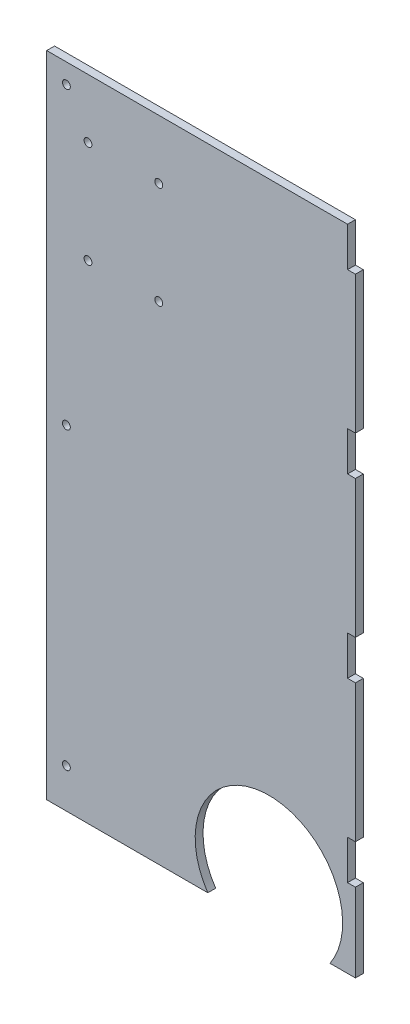
ISO-10303-21;
HEADER;
FILE_DESCRIPTION(('STEP AP214'),'2;1');
FILE_NAME('part.step','',(''),(''),'','','');
FILE_SCHEMA(('AUTOMOTIVE_DESIGN { 1 0 10303 214 1 1 1 1 }'));
ENDSEC;
DATA;
#1=APPLICATION_CONTEXT('core data for automotive mechanical design processes');
#2=APPLICATION_PROTOCOL_DEFINITION('international standard','automotive_design',2000,#1);
#3=PRODUCT_CONTEXT('',#1,'mechanical');
#4=PRODUCT('Part','Part','',(#3));
#5=PRODUCT_RELATED_PRODUCT_CATEGORY('part','',(#4));
#6=PRODUCT_DEFINITION_FORMATION('','',#4);
#7=PRODUCT_DEFINITION_CONTEXT('part definition',#1,'design');
#8=PRODUCT_DEFINITION('design','',#6,#7);
#9=PRODUCT_DEFINITION_SHAPE('','',#8);
#10=(LENGTH_UNIT() NAMED_UNIT(*) SI_UNIT(.MILLI.,.METRE.));
#11=(NAMED_UNIT(*) PLANE_ANGLE_UNIT() SI_UNIT($,.RADIAN.));
#12=(NAMED_UNIT(*) SI_UNIT($,.STERADIAN.) SOLID_ANGLE_UNIT());
#13=UNCERTAINTY_MEASURE_WITH_UNIT(LENGTH_MEASURE(1.E-05),#10,'distance_accuracy_value','');
#14=(GEOMETRIC_REPRESENTATION_CONTEXT(3) GLOBAL_UNCERTAINTY_ASSIGNED_CONTEXT((#13)) GLOBAL_UNIT_ASSIGNED_CONTEXT((#10,
#11,#12)) REPRESENTATION_CONTEXT('',''));
#15=CARTESIAN_POINT('',(0.,0.,0.));
#16=DIRECTION('',(0.,0.,1.));
#17=DIRECTION('',(1.,0.,0.));
#18=AXIS2_PLACEMENT_3D('',#15,#16,#17);
#19=CARTESIAN_POINT('',(82.0000000000016,149.999999999996,4.));
#20=DIRECTION('',(-1.,0.,0.));
#21=DIRECTION('',(0.,-1.,0.));
#22=AXIS2_PLACEMENT_3D('',#19,#20,#21);
#23=PLANE('',#22);
#24=DIRECTION('',(0.,1.,0.));
#25=VECTOR('',#24,1.);
#26=CARTESIAN_POINT('',(82.0000000000016,149.999999999996,0.));
#27=LINE('',#26,#25);
#28=CARTESIAN_POINT('',(82.0000000000016,-30.0000000000036,0.));
#29=VERTEX_POINT('',#28);
#30=CARTESIAN_POINT('',(82.0000000000015,39.9999999999964,0.));
#31=VERTEX_POINT('',#30);
#32=EDGE_CURVE('E445',#29,#31,#27,.T.);
#33=ORIENTED_EDGE('',*,*,#32,.T.);
#34=DIRECTION('',(0.,0.,-1.));
#35=VECTOR('',#34,1.);
#36=CARTESIAN_POINT('',(82.0000000000015,39.9999999999964,4.));
#37=LINE('',#36,#35);
#38=CARTESIAN_POINT('',(82.0000000000015,39.9999999999964,4.));
#39=VERTEX_POINT('',#38);
#40=EDGE_CURVE('E466',#39,#31,#37,.T.);
#41=ORIENTED_EDGE('',*,*,#40,.F.);
#42=DIRECTION('',(0.,1.,0.));
#43=VECTOR('',#42,1.);
#44=CARTESIAN_POINT('',(82.0000000000016,149.999999999996,4.));
#45=LINE('',#44,#43);
#46=CARTESIAN_POINT('',(82.0000000000016,-30.0000000000036,4.));
#47=VERTEX_POINT('',#46);
#48=EDGE_CURVE('E449',#47,#39,#45,.T.);
#49=ORIENTED_EDGE('',*,*,#48,.F.);
#50=DIRECTION('',(0.,0.,-1.));
#51=VECTOR('',#50,1.);
#52=CARTESIAN_POINT('',(82.0000000000016,-30.0000000000036,4.));
#53=LINE('',#52,#51);
#54=EDGE_CURVE('E464',#47,#29,#53,.T.);
#55=ORIENTED_EDGE('',*,*,#54,.T.);
#56=EDGE_LOOP('',(#33,#41,#49,#55));
#57=FACE_BOUND('',#56,.T.);
#58=ADVANCED_FACE('F33',(#57),#23,.F.);
#59=CARTESIAN_POINT('',(82.0000000000015,-120.000000000004,0.));
#60=VERTEX_POINT('',#59);
#61=CARTESIAN_POINT('',(82.0000000000016,-50.0000000000036,0.));
#62=VERTEX_POINT('',#61);
#63=EDGE_CURVE('E182',#60,#62,#27,.T.);
#64=ORIENTED_EDGE('',*,*,#63,.T.);
#65=DIRECTION('',(0.,0.,-1.));
#66=VECTOR('',#65,1.);
#67=CARTESIAN_POINT('',(82.0000000000016,-50.0000000000036,4.));
#68=LINE('',#67,#66);
#69=CARTESIAN_POINT('',(82.0000000000016,-50.0000000000036,4.));
#70=VERTEX_POINT('',#69);
#71=EDGE_CURVE('E496',#70,#62,#68,.T.);
#72=ORIENTED_EDGE('',*,*,#71,.F.);
#73=CARTESIAN_POINT('',(82.0000000000016,-120.000000000004,4.));
#74=VERTEX_POINT('',#73);
#75=EDGE_CURVE('E438',#74,#70,#45,.T.);
#76=ORIENTED_EDGE('',*,*,#75,.F.);
#77=DIRECTION('',(0.,0.,-1.));
#78=VECTOR('',#77,1.);
#79=CARTESIAN_POINT('',(82.0000000000016,-120.000000000004,4.));
#80=LINE('',#79,#78);
#81=EDGE_CURVE('E428',#74,#60,#80,.T.);
#82=ORIENTED_EDGE('',*,*,#81,.T.);
#83=EDGE_LOOP('',(#64,#72,#76,#82));
#84=FACE_BOUND('',#83,.T.);
#85=ADVANCED_FACE('F258',(#84),#23,.F.);
#86=CARTESIAN_POINT('',(82.0000000000008,-180.000000000003,0.));
#87=VERTEX_POINT('',#86);
#88=CARTESIAN_POINT('',(82.0000000000016,-140.000000000004,0.));
#89=VERTEX_POINT('',#88);
#90=EDGE_CURVE('E171',#87,#89,#27,.T.);
#91=ORIENTED_EDGE('',*,*,#90,.T.);
#92=DIRECTION('',(0.,0.,-1.));
#93=VECTOR('',#92,1.);
#94=CARTESIAN_POINT('',(82.0000000000016,-140.000000000004,4.));
#95=LINE('',#94,#93);
#96=CARTESIAN_POINT('',(82.0000000000016,-140.000000000004,4.));
#97=VERTEX_POINT('',#96);
#98=EDGE_CURVE('E439',#97,#89,#95,.T.);
#99=ORIENTED_EDGE('',*,*,#98,.F.);
#100=CARTESIAN_POINT('',(82.0000000000008,-180.000000000003,4.));
#101=VERTEX_POINT('',#100);
#102=EDGE_CURVE('E189',#101,#97,#45,.T.);
#103=ORIENTED_EDGE('',*,*,#102,.F.);
#104=DIRECTION('',(0.,0.,1.));
#105=VECTOR('',#104,1.);
#106=CARTESIAN_POINT('',(82.0000000000008,-180.000000000003,0.));
#107=LINE('',#106,#105);
#108=EDGE_CURVE('E186',#87,#101,#107,.T.);
#109=ORIENTED_EDGE('',*,*,#108,.F.);
#110=EDGE_LOOP('',(#91,#99,#103,#109));
#111=FACE_BOUND('',#110,.T.);
#112=ADVANCED_FACE('F187',(#111),#23,.F.);
#113=CARTESIAN_POINT('',(-74.9999999999984,-180.000000000003,4.));
#114=DIRECTION('',(0.,1.,0.));
#115=DIRECTION('',(0.,0.,1.));
#116=AXIS2_PLACEMENT_3D('',#113,#114,#115);
#117=PLANE('',#116);
#118=DIRECTION('',(1.,0.,0.));
#119=VECTOR('',#118,1.);
#120=CARTESIAN_POINT('',(-74.9999999999984,-180.000000000003,0.));
#121=LINE('',#120,#119);
#122=CARTESIAN_POINT('',(-74.9999999999984,-180.000000000003,0.));
#123=VERTEX_POINT('',#122);
#124=CARTESIAN_POINT('',(6.93152723420449,-180.000000000003,0.));
#125=VERTEX_POINT('',#124);
#126=EDGE_CURVE('E199',#123,#125,#121,.T.);
#127=ORIENTED_EDGE('',*,*,#126,.T.);
#128=DIRECTION('',(0.,0.,1.));
#129=VECTOR('',#128,1.);
#130=CARTESIAN_POINT('',(6.93152723420449,-180.000000000003,0.));
#131=LINE('',#130,#129);
#132=CARTESIAN_POINT('',(6.93152723420449,-180.000000000003,4.));
#133=VERTEX_POINT('',#132);
#134=EDGE_CURVE('E228',#125,#133,#131,.T.);
#135=ORIENTED_EDGE('',*,*,#134,.T.);
#136=DIRECTION('',(1.,0.,0.));
#137=VECTOR('',#136,1.);
#138=CARTESIAN_POINT('',(-74.9999999999984,-180.000000000003,4.));
#139=LINE('',#138,#137);
#140=CARTESIAN_POINT('',(-74.9999999999984,-180.000000000003,4.));
#141=VERTEX_POINT('',#140);
#142=EDGE_CURVE('E210',#141,#133,#139,.T.);
#143=ORIENTED_EDGE('',*,*,#142,.F.);
#144=DIRECTION('',(0.,0.,-1.));
#145=VECTOR('',#144,1.);
#146=CARTESIAN_POINT('',(-74.9999999999984,-180.000000000003,4.));
#147=LINE('',#146,#145);
#148=EDGE_CURVE('E208',#141,#123,#147,.T.);
#149=ORIENTED_EDGE('',*,*,#148,.T.);
#150=EDGE_LOOP('',(#127,#135,#143,#149));
#151=FACE_BOUND('',#150,.T.);
#152=ADVANCED_FACE('F226',(#151),#117,.F.);
#153=CARTESIAN_POINT('',(-74.9999999999984,149.999999999996,4.));
#154=DIRECTION('',(0.,-1.,0.));
#155=DIRECTION('',(0.,0.,-1.));
#156=AXIS2_PLACEMENT_3D('',#153,#154,#155);
#157=PLANE('',#156);
#158=DIRECTION('',(-1.,0.,0.));
#159=VECTOR('',#158,1.);
#160=CARTESIAN_POINT('',(-74.9999999999984,149.999999999996,4.));
#161=LINE('',#160,#159);
#162=CARTESIAN_POINT('',(78.0000000000015,149.999999999996,4.));
#163=VERTEX_POINT('',#162);
#164=CARTESIAN_POINT('',(-74.9999999999984,149.999999999996,4.));
#165=VERTEX_POINT('',#164);
#166=EDGE_CURVE('E203',#163,#165,#161,.T.);
#167=ORIENTED_EDGE('',*,*,#166,.F.);
#168=DIRECTION('',(0.,0.,-1.));
#169=VECTOR('',#168,1.);
#170=CARTESIAN_POINT('',(78.0000000000015,149.999999999996,4.));
#171=LINE('',#170,#169);
#172=CARTESIAN_POINT('',(78.0000000000015,149.999999999996,0.));
#173=VERTEX_POINT('',#172);
#174=EDGE_CURVE('E529',#163,#173,#171,.T.);
#175=ORIENTED_EDGE('',*,*,#174,.T.);
#176=DIRECTION('',(-1.,0.,0.));
#177=VECTOR('',#176,1.);
#178=CARTESIAN_POINT('',(-74.9999999999984,149.999999999996,0.));
#179=LINE('',#178,#177);
#180=CARTESIAN_POINT('',(-74.9999999999984,149.999999999996,0.));
#181=VERTEX_POINT('',#180);
#182=EDGE_CURVE('E204',#173,#181,#179,.T.);
#183=ORIENTED_EDGE('',*,*,#182,.T.);
#184=DIRECTION('',(0.,0.,-1.));
#185=VECTOR('',#184,1.);
#186=CARTESIAN_POINT('',(-74.9999999999984,149.999999999996,4.));
#187=LINE('',#186,#185);
#188=EDGE_CURVE('E41',#165,#181,#187,.T.);
#189=ORIENTED_EDGE('',*,*,#188,.F.);
#190=EDGE_LOOP('',(#167,#175,#183,#189));
#191=FACE_BOUND('',#190,.T.);
#192=ADVANCED_FACE('F35',(#191),#157,.F.);
#193=CARTESIAN_POINT('',(-74.9999999999984,149.999999999996,4.));
#194=DIRECTION('',(1.,0.,0.));
#195=DIRECTION('',(0.,1.,0.));
#196=AXIS2_PLACEMENT_3D('',#193,#194,#195);
#197=PLANE('',#196);
#198=DIRECTION('',(0.,-1.,0.));
#199=VECTOR('',#198,1.);
#200=CARTESIAN_POINT('',(-74.9999999999984,149.999999999996,0.));
#201=LINE('',#200,#199);
#202=EDGE_CURVE('E200',#181,#123,#201,.T.);
#203=ORIENTED_EDGE('',*,*,#202,.T.);
#204=ORIENTED_EDGE('',*,*,#148,.F.);
#205=DIRECTION('',(0.,-1.,0.));
#206=VECTOR('',#205,1.);
#207=CARTESIAN_POINT('',(-74.9999999999984,149.999999999996,4.));
#208=LINE('',#207,#206);
#209=EDGE_CURVE('E218',#165,#141,#208,.T.);
#210=ORIENTED_EDGE('',*,*,#209,.F.);
#211=ORIENTED_EDGE('',*,*,#188,.T.);
#212=EDGE_LOOP('',(#203,#204,#210,#211));
#213=FACE_BOUND('',#212,.T.);
#214=ADVANCED_FACE('F216',(#213),#197,.F.);
#215=CARTESIAN_POINT('',(69.0684727658297,-180.000000000003,0.));
#216=VERTEX_POINT('',#215);
#217=EDGE_CURVE('E175',#216,#87,#121,.T.);
#218=ORIENTED_EDGE('',*,*,#217,.T.);
#219=ORIENTED_EDGE('',*,*,#108,.T.);
#220=CARTESIAN_POINT('',(69.0684727658297,-180.000000000003,4.));
#221=VERTEX_POINT('',#220);
#222=EDGE_CURVE('E232',#221,#101,#139,.T.);
#223=ORIENTED_EDGE('',*,*,#222,.F.);
#224=DIRECTION('',(0.,0.,1.));
#225=VECTOR('',#224,1.);
#226=CARTESIAN_POINT('',(69.0684727658297,-180.000000000003,0.));
#227=LINE('',#226,#225);
#228=EDGE_CURVE('E198',#221,#216,#227,.F.);
#229=ORIENTED_EDGE('',*,*,#228,.T.);
#230=EDGE_LOOP('',(#218,#219,#223,#229));
#231=FACE_BOUND('',#230,.T.);
#232=ADVANCED_FACE('F197',(#231),#117,.F.);
#233=CARTESIAN_POINT('',(0.,0.,4.));
#234=DIRECTION('',(0.,0.,1.));
#235=DIRECTION('',(1.,0.,0.));
#236=AXIS2_PLACEMENT_3D('',#233,#234,#235);
#237=PLANE('',#236);
#238=CARTESIAN_POINT('',(-64.9999999999984,139.999999999996,4.));
#239=DIRECTION('',(0.,0.,1.));
#240=DIRECTION('',(1.,0.,0.));
#241=AXIS2_PLACEMENT_3D('',#238,#239,#240);
#242=CIRCLE('',#241,2.);
#243=CARTESIAN_POINT('',(-62.9999999999984,139.999999999996,4.));
#244=VERTEX_POINT('',#243);
#245=EDGE_CURVE('E573',#244,#244,#242,.T.);
#246=ORIENTED_EDGE('',*,*,#245,.F.);
#247=EDGE_LOOP('',(#246));
#248=FACE_BOUND('',#247,.T.);
#249=CARTESIAN_POINT('',(-64.9999999999984,-10.0000000000036,4.));
#250=DIRECTION('',(0.,0.,1.));
#251=DIRECTION('',(1.,0.,0.));
#252=AXIS2_PLACEMENT_3D('',#249,#250,#251);
#253=CIRCLE('',#252,2.);
#254=CARTESIAN_POINT('',(-62.9999999999984,-10.0000000000036,4.));
#255=VERTEX_POINT('',#254);
#256=EDGE_CURVE('E567',#255,#255,#253,.T.);
#257=ORIENTED_EDGE('',*,*,#256,.F.);
#258=EDGE_LOOP('',(#257));
#259=FACE_BOUND('',#258,.T.);
#260=CARTESIAN_POINT('',(-64.9999999999984,-160.000000000004,4.));
#261=DIRECTION('',(0.,0.,1.));
#262=DIRECTION('',(1.,0.,0.));
#263=AXIS2_PLACEMENT_3D('',#260,#261,#262);
#264=CIRCLE('',#263,2.);
#265=CARTESIAN_POINT('',(-62.9999999999984,-160.000000000004,4.));
#266=VERTEX_POINT('',#265);
#267=EDGE_CURVE('E561',#266,#266,#264,.T.);
#268=ORIENTED_EDGE('',*,*,#267,.F.);
#269=EDGE_LOOP('',(#268));
#270=FACE_BOUND('',#269,.T.);
#271=CARTESIAN_POINT('',(-53.9999999999984,119.999999999996,4.));
#272=DIRECTION('',(0.,0.,-1.));
#273=DIRECTION('',(-1.,0.,0.));
#274=AXIS2_PLACEMENT_3D('',#271,#272,#273);
#275=CIRCLE('',#274,2.);
#276=CARTESIAN_POINT('',(-55.9999999999984,119.999999999996,4.));
#277=VERTEX_POINT('',#276);
#278=EDGE_CURVE('E540',#277,#277,#275,.T.);
#279=ORIENTED_EDGE('',*,*,#278,.T.);
#280=EDGE_LOOP('',(#279));
#281=FACE_BOUND('',#280,.T.);
#282=CARTESIAN_POINT('',(-17.9999999999984,67.9999999999964,4.));
#283=DIRECTION('',(0.,0.,-1.));
#284=DIRECTION('',(-1.,0.,0.));
#285=AXIS2_PLACEMENT_3D('',#282,#283,#284);
#286=CIRCLE('',#285,2.);
#287=CARTESIAN_POINT('',(-19.9999999999984,67.9999999999964,4.));
#288=VERTEX_POINT('',#287);
#289=EDGE_CURVE('E546',#288,#288,#286,.T.);
#290=ORIENTED_EDGE('',*,*,#289,.T.);
#291=EDGE_LOOP('',(#290));
#292=FACE_BOUND('',#291,.T.);
#293=CARTESIAN_POINT('',(-53.9999999999984,67.9999999999964,4.));
#294=DIRECTION('',(0.,0.,-1.));
#295=DIRECTION('',(-1.,0.,0.));
#296=AXIS2_PLACEMENT_3D('',#293,#294,#295);
#297=CIRCLE('',#296,2.);
#298=CARTESIAN_POINT('',(-55.9999999999984,67.9999999999964,4.));
#299=VERTEX_POINT('',#298);
#300=EDGE_CURVE('E547',#299,#299,#297,.T.);
#301=ORIENTED_EDGE('',*,*,#300,.T.);
#302=EDGE_LOOP('',(#301));
#303=FACE_BOUND('',#302,.T.);
#304=CARTESIAN_POINT('',(-17.9999999999984,119.999999999996,4.));
#305=DIRECTION('',(0.,0.,-1.));
#306=DIRECTION('',(-1.,0.,0.));
#307=AXIS2_PLACEMENT_3D('',#304,#305,#306);
#308=CIRCLE('',#307,2.);
#309=CARTESIAN_POINT('',(-19.9999999999984,119.999999999996,4.));
#310=VERTEX_POINT('',#309);
#311=EDGE_CURVE('E194',#310,#310,#308,.T.);
#312=ORIENTED_EDGE('',*,*,#311,.T.);
#313=EDGE_LOOP('',(#312));
#314=FACE_BOUND('',#313,.T.);
#315=ORIENTED_EDGE('',*,*,#222,.T.);
#316=ORIENTED_EDGE('',*,*,#102,.T.);
#317=DIRECTION('',(-1.,0.,0.));
#318=VECTOR('',#317,1.);
#319=CARTESIAN_POINT('',(78.0000000000015,-140.000000000004,4.));
#320=LINE('',#319,#318);
#321=CARTESIAN_POINT('',(78.0000000000015,-140.000000000004,4.));
#322=VERTEX_POINT('',#321);
#323=EDGE_CURVE('E505',#97,#322,#320,.T.);
#324=ORIENTED_EDGE('',*,*,#323,.T.);
#325=DIRECTION('',(0.,1.,0.));
#326=VECTOR('',#325,1.);
#327=CARTESIAN_POINT('',(78.0000000000015,-120.000000000004,4.));
#328=LINE('',#327,#326);
#329=CARTESIAN_POINT('',(78.0000000000015,-120.000000000004,4.));
#330=VERTEX_POINT('',#329);
#331=EDGE_CURVE('E500',#322,#330,#328,.T.);
#332=ORIENTED_EDGE('',*,*,#331,.T.);
#333=DIRECTION('',(1.,0.,0.));
#334=VECTOR('',#333,1.);
#335=CARTESIAN_POINT('',(78.0000000000015,-120.000000000004,4.));
#336=LINE('',#335,#334);
#337=EDGE_CURVE('E503',#330,#74,#336,.T.);
#338=ORIENTED_EDGE('',*,*,#337,.T.);
#339=ORIENTED_EDGE('',*,*,#75,.T.);
#340=DIRECTION('',(-1.,0.,0.));
#341=VECTOR('',#340,1.);
#342=CARTESIAN_POINT('',(78.0000000000015,-50.0000000000036,4.));
#343=LINE('',#342,#341);
#344=CARTESIAN_POINT('',(78.0000000000015,-50.0000000000036,4.));
#345=VERTEX_POINT('',#344);
#346=EDGE_CURVE('E482',#70,#345,#343,.T.);
#347=ORIENTED_EDGE('',*,*,#346,.T.);
#348=DIRECTION('',(0.,1.,0.));
#349=VECTOR('',#348,1.);
#350=CARTESIAN_POINT('',(78.0000000000015,-30.0000000000036,4.));
#351=LINE('',#350,#349);
#352=CARTESIAN_POINT('',(78.0000000000015,-30.0000000000036,4.));
#353=VERTEX_POINT('',#352);
#354=EDGE_CURVE('E479',#345,#353,#351,.T.);
#355=ORIENTED_EDGE('',*,*,#354,.T.);
#356=DIRECTION('',(1.,0.,0.));
#357=VECTOR('',#356,1.);
#358=CARTESIAN_POINT('',(78.0000000000015,-30.0000000000036,4.));
#359=LINE('',#358,#357);
#360=EDGE_CURVE('E461',#353,#47,#359,.T.);
#361=ORIENTED_EDGE('',*,*,#360,.T.);
#362=ORIENTED_EDGE('',*,*,#48,.T.);
#363=DIRECTION('',(-1.,0.,0.));
#364=VECTOR('',#363,1.);
#365=CARTESIAN_POINT('',(78.0000000000015,39.9999999999964,4.));
#366=LINE('',#365,#364);
#367=CARTESIAN_POINT('',(78.0000000000015,39.9999999999964,4.));
#368=VERTEX_POINT('',#367);
#369=EDGE_CURVE('E458',#39,#368,#366,.T.);
#370=ORIENTED_EDGE('',*,*,#369,.T.);
#371=DIRECTION('',(0.,1.,0.));
#372=VECTOR('',#371,1.);
#373=CARTESIAN_POINT('',(78.0000000000015,59.9999999999964,4.));
#374=LINE('',#373,#372);
#375=CARTESIAN_POINT('',(78.0000000000015,59.9999999999964,4.));
#376=VERTEX_POINT('',#375);
#377=EDGE_CURVE('E516',#368,#376,#374,.T.);
#378=ORIENTED_EDGE('',*,*,#377,.T.);
#379=DIRECTION('',(1.,0.,0.));
#380=VECTOR('',#379,1.);
#381=CARTESIAN_POINT('',(78.0000000000015,59.9999999999964,4.));
#382=LINE('',#381,#380);
#383=CARTESIAN_POINT('',(82.0000000000016,59.9999999999964,4.));
#384=VERTEX_POINT('',#383);
#385=EDGE_CURVE('E517',#376,#384,#382,.T.);
#386=ORIENTED_EDGE('',*,*,#385,.T.);
#387=CARTESIAN_POINT('',(82.0000000000016,129.999999999996,4.));
#388=VERTEX_POINT('',#387);
#389=EDGE_CURVE('E181',#384,#388,#45,.T.);
#390=ORIENTED_EDGE('',*,*,#389,.T.);
#391=DIRECTION('',(-1.,0.,0.));
#392=VECTOR('',#391,1.);
#393=CARTESIAN_POINT('',(78.0000000000015,129.999999999996,4.));
#394=LINE('',#393,#392);
#395=CARTESIAN_POINT('',(78.0000000000015,129.999999999996,4.));
#396=VERTEX_POINT('',#395);
#397=EDGE_CURVE('E48',#388,#396,#394,.T.);
#398=ORIENTED_EDGE('',*,*,#397,.T.);
#399=DIRECTION('',(0.,1.,0.));
#400=VECTOR('',#399,1.);
#401=CARTESIAN_POINT('',(78.0000000000015,149.999999999996,4.));
#402=LINE('',#401,#400);
#403=EDGE_CURVE('E527',#396,#163,#402,.T.);
#404=ORIENTED_EDGE('',*,*,#403,.T.);
#405=ORIENTED_EDGE('',*,*,#166,.T.);
#406=ORIENTED_EDGE('',*,*,#209,.T.);
#407=ORIENTED_EDGE('',*,*,#142,.T.);
#408=CARTESIAN_POINT('',(38.0000000000171,-159.000000000004,4.));
#409=DIRECTION('',(0.,0.,1.));
#410=DIRECTION('',(1.,0.,0.));
#411=AXIS2_PLACEMENT_3D('',#408,#409,#410);
#412=CIRCLE('',#411,37.5);
#413=EDGE_CURVE('E238',#221,#133,#412,.T.);
#414=ORIENTED_EDGE('',*,*,#413,.F.);
#415=EDGE_LOOP('',(#315,#316,#324,#332,#338,#339,#347,#355,#361,#362,#370,#378,#386,#390,#398,
#404,#405,#406,#407,#414));
#416=FACE_BOUND('',#415,.T.);
#417=ADVANCED_FACE('F242',(#248,#259,#270,#281,#292,#303,#314,#416),#237,.T.);
#418=CARTESIAN_POINT('',(0.,0.,0.));
#419=DIRECTION('',(0.,0.,1.));
#420=DIRECTION('',(1.,0.,0.));
#421=AXIS2_PLACEMENT_3D('',#418,#419,#420);
#422=PLANE('',#421);
#423=CARTESIAN_POINT('',(-64.9999999999984,139.999999999996,0.));
#424=DIRECTION('',(0.,0.,1.));
#425=DIRECTION('',(1.,0.,0.));
#426=AXIS2_PLACEMENT_3D('',#423,#424,#425);
#427=CIRCLE('',#426,2.);
#428=CARTESIAN_POINT('',(-62.9999999999984,139.999999999996,0.));
#429=VERTEX_POINT('',#428);
#430=EDGE_CURVE('E558',#429,#429,#427,.T.);
#431=ORIENTED_EDGE('',*,*,#430,.T.);
#432=EDGE_LOOP('',(#431));
#433=FACE_BOUND('',#432,.T.);
#434=CARTESIAN_POINT('',(-64.9999999999984,-10.0000000000036,0.));
#435=DIRECTION('',(0.,0.,1.));
#436=DIRECTION('',(1.,0.,0.));
#437=AXIS2_PLACEMENT_3D('',#434,#435,#436);
#438=CIRCLE('',#437,2.);
#439=CARTESIAN_POINT('',(-62.9999999999984,-10.0000000000036,0.));
#440=VERTEX_POINT('',#439);
#441=EDGE_CURVE('E570',#440,#440,#438,.T.);
#442=ORIENTED_EDGE('',*,*,#441,.T.);
#443=EDGE_LOOP('',(#442));
#444=FACE_BOUND('',#443,.T.);
#445=CARTESIAN_POINT('',(-64.9999999999984,-160.000000000004,0.));
#446=DIRECTION('',(0.,0.,1.));
#447=DIRECTION('',(1.,0.,0.));
#448=AXIS2_PLACEMENT_3D('',#445,#446,#447);
#449=CIRCLE('',#448,2.);
#450=CARTESIAN_POINT('',(-62.9999999999984,-160.000000000004,0.));
#451=VERTEX_POINT('',#450);
#452=EDGE_CURVE('E564',#451,#451,#449,.T.);
#453=ORIENTED_EDGE('',*,*,#452,.T.);
#454=EDGE_LOOP('',(#453));
#455=FACE_BOUND('',#454,.T.);
#456=CARTESIAN_POINT('',(-53.9999999999984,119.999999999996,0.));
#457=DIRECTION('',(0.,0.,-1.));
#458=DIRECTION('',(-1.,0.,0.));
#459=AXIS2_PLACEMENT_3D('',#456,#457,#458);
#460=CIRCLE('',#459,2.);
#461=CARTESIAN_POINT('',(-55.9999999999984,119.999999999996,0.));
#462=VERTEX_POINT('',#461);
#463=EDGE_CURVE('E550',#462,#462,#460,.T.);
#464=ORIENTED_EDGE('',*,*,#463,.F.);
#465=EDGE_LOOP('',(#464));
#466=FACE_BOUND('',#465,.T.);
#467=CARTESIAN_POINT('',(-17.9999999999984,67.9999999999964,0.));
#468=DIRECTION('',(0.,0.,-1.));
#469=DIRECTION('',(-1.,0.,0.));
#470=AXIS2_PLACEMENT_3D('',#467,#468,#469);
#471=CIRCLE('',#470,2.);
#472=CARTESIAN_POINT('',(-19.9999999999984,67.9999999999964,0.));
#473=VERTEX_POINT('',#472);
#474=EDGE_CURVE('E543',#473,#473,#471,.T.);
#475=ORIENTED_EDGE('',*,*,#474,.F.);
#476=EDGE_LOOP('',(#475));
#477=FACE_BOUND('',#476,.T.);
#478=CARTESIAN_POINT('',(-53.9999999999984,67.9999999999964,0.));
#479=DIRECTION('',(0.,0.,-1.));
#480=DIRECTION('',(-1.,0.,0.));
#481=AXIS2_PLACEMENT_3D('',#478,#479,#480);
#482=CIRCLE('',#481,2.);
#483=CARTESIAN_POINT('',(-55.9999999999984,67.9999999999964,0.));
#484=VERTEX_POINT('',#483);
#485=EDGE_CURVE('E555',#484,#484,#482,.T.);
#486=ORIENTED_EDGE('',*,*,#485,.F.);
#487=EDGE_LOOP('',(#486));
#488=FACE_BOUND('',#487,.T.);
#489=CARTESIAN_POINT('',(-17.9999999999984,119.999999999996,0.));
#490=DIRECTION('',(0.,0.,-1.));
#491=DIRECTION('',(-1.,0.,0.));
#492=AXIS2_PLACEMENT_3D('',#489,#490,#491);
#493=CIRCLE('',#492,2.);
#494=CARTESIAN_POINT('',(-19.9999999999984,119.999999999996,0.));
#495=VERTEX_POINT('',#494);
#496=EDGE_CURVE('E537',#495,#495,#493,.T.);
#497=ORIENTED_EDGE('',*,*,#496,.F.);
#498=EDGE_LOOP('',(#497));
#499=FACE_BOUND('',#498,.T.);
#500=ORIENTED_EDGE('',*,*,#90,.F.);
#501=ORIENTED_EDGE('',*,*,#217,.F.);
#502=CARTESIAN_POINT('',(38.0000000000171,-159.000000000004,0.));
#503=DIRECTION('',(0.,0.,1.));
#504=DIRECTION('',(1.,0.,0.));
#505=AXIS2_PLACEMENT_3D('',#502,#503,#504);
#506=CIRCLE('',#505,37.5);
#507=EDGE_CURVE('E11',#216,#125,#506,.T.);
#508=ORIENTED_EDGE('',*,*,#507,.T.);
#509=ORIENTED_EDGE('',*,*,#126,.F.);
#510=ORIENTED_EDGE('',*,*,#202,.F.);
#511=ORIENTED_EDGE('',*,*,#182,.F.);
#512=DIRECTION('',(0.,1.,0.));
#513=VECTOR('',#512,1.);
#514=CARTESIAN_POINT('',(78.0000000000015,149.999999999996,0.));
#515=LINE('',#514,#513);
#516=CARTESIAN_POINT('',(78.0000000000015,129.999999999996,0.));
#517=VERTEX_POINT('',#516);
#518=EDGE_CURVE('E531',#517,#173,#515,.T.);
#519=ORIENTED_EDGE('',*,*,#518,.F.);
#520=DIRECTION('',(-1.,0.,0.));
#521=VECTOR('',#520,1.);
#522=CARTESIAN_POINT('',(78.0000000000015,129.999999999996,0.));
#523=LINE('',#522,#521);
#524=CARTESIAN_POINT('',(82.0000000000015,129.999999999996,0.));
#525=VERTEX_POINT('',#524);
#526=EDGE_CURVE('E472',#525,#517,#523,.T.);
#527=ORIENTED_EDGE('',*,*,#526,.F.);
#528=CARTESIAN_POINT('',(82.0000000000016,59.9999999999964,0.));
#529=VERTEX_POINT('',#528);
#530=EDGE_CURVE('E184',#529,#525,#27,.T.);
#531=ORIENTED_EDGE('',*,*,#530,.F.);
#532=DIRECTION('',(1.,0.,0.));
#533=VECTOR('',#532,1.);
#534=CARTESIAN_POINT('',(78.0000000000015,59.9999999999964,0.));
#535=LINE('',#534,#533);
#536=CARTESIAN_POINT('',(78.0000000000015,59.9999999999964,0.));
#537=VERTEX_POINT('',#536);
#538=EDGE_CURVE('E56',#537,#529,#535,.T.);
#539=ORIENTED_EDGE('',*,*,#538,.F.);
#540=DIRECTION('',(0.,1.,0.));
#541=VECTOR('',#540,1.);
#542=CARTESIAN_POINT('',(78.0000000000015,59.9999999999964,0.));
#543=LINE('',#542,#541);
#544=CARTESIAN_POINT('',(78.0000000000015,39.9999999999964,0.));
#545=VERTEX_POINT('',#544);
#546=EDGE_CURVE('E495',#545,#537,#543,.T.);
#547=ORIENTED_EDGE('',*,*,#546,.F.);
#548=DIRECTION('',(-1.,0.,0.));
#549=VECTOR('',#548,1.);
#550=CARTESIAN_POINT('',(78.0000000000015,39.9999999999964,0.));
#551=LINE('',#550,#549);
#552=EDGE_CURVE('E514',#31,#545,#551,.T.);
#553=ORIENTED_EDGE('',*,*,#552,.F.);
#554=ORIENTED_EDGE('',*,*,#32,.F.);
#555=DIRECTION('',(1.,0.,0.));
#556=VECTOR('',#555,1.);
#557=CARTESIAN_POINT('',(78.0000000000015,-30.0000000000036,0.));
#558=LINE('',#557,#556);
#559=CARTESIAN_POINT('',(78.0000000000015,-30.0000000000036,0.));
#560=VERTEX_POINT('',#559);
#561=EDGE_CURVE('E489',#560,#29,#558,.T.);
#562=ORIENTED_EDGE('',*,*,#561,.F.);
#563=DIRECTION('',(0.,1.,0.));
#564=VECTOR('',#563,1.);
#565=CARTESIAN_POINT('',(78.0000000000015,-30.0000000000036,0.));
#566=LINE('',#565,#564);
#567=CARTESIAN_POINT('',(78.0000000000015,-50.0000000000036,0.));
#568=VERTEX_POINT('',#567);
#569=EDGE_CURVE('E486',#568,#560,#566,.T.);
#570=ORIENTED_EDGE('',*,*,#569,.F.);
#571=DIRECTION('',(-1.,0.,0.));
#572=VECTOR('',#571,1.);
#573=CARTESIAN_POINT('',(78.0000000000015,-50.0000000000036,0.));
#574=LINE('',#573,#572);
#575=EDGE_CURVE('E444',#62,#568,#574,.T.);
#576=ORIENTED_EDGE('',*,*,#575,.F.);
#577=ORIENTED_EDGE('',*,*,#63,.F.);
#578=DIRECTION('',(1.,0.,0.));
#579=VECTOR('',#578,1.);
#580=CARTESIAN_POINT('',(78.0000000000015,-120.000000000004,0.));
#581=LINE('',#580,#579);
#582=CARTESIAN_POINT('',(78.0000000000015,-120.000000000004,0.));
#583=VERTEX_POINT('',#582);
#584=EDGE_CURVE('E425',#583,#60,#581,.T.);
#585=ORIENTED_EDGE('',*,*,#584,.F.);
#586=DIRECTION('',(0.,1.,0.));
#587=VECTOR('',#586,1.);
#588=CARTESIAN_POINT('',(78.0000000000015,-120.000000000004,0.));
#589=LINE('',#588,#587);
#590=CARTESIAN_POINT('',(78.0000000000015,-140.000000000004,0.));
#591=VERTEX_POINT('',#590);
#592=EDGE_CURVE('E193',#591,#583,#589,.T.);
#593=ORIENTED_EDGE('',*,*,#592,.F.);
#594=DIRECTION('',(-1.,0.,0.));
#595=VECTOR('',#594,1.);
#596=CARTESIAN_POINT('',(78.0000000000015,-140.000000000004,0.));
#597=LINE('',#596,#595);
#598=EDGE_CURVE('E178',#89,#591,#597,.T.);
#599=ORIENTED_EDGE('',*,*,#598,.F.);
#600=EDGE_LOOP('',(#500,#501,#508,#509,#510,#511,#519,#527,#531,#539,#547,#553,#554,#562,#570,
#576,#577,#585,#593,#599));
#601=FACE_BOUND('',#600,.T.);
#602=ADVANCED_FACE('F173',(#433,#444,#455,#466,#477,#488,#499,#601),#422,.F.);
#603=CARTESIAN_POINT('',(38.0000000000171,-159.000000000004,0.));
#604=DIRECTION('',(0.,0.,1.));
#605=DIRECTION('',(1.,0.,0.));
#606=AXIS2_PLACEMENT_3D('',#603,#604,#605);
#607=CYLINDRICAL_SURFACE('',#606,37.5);
#608=ORIENTED_EDGE('',*,*,#507,.F.);
#609=ORIENTED_EDGE('',*,*,#228,.F.);
#610=ORIENTED_EDGE('',*,*,#413,.T.);
#611=ORIENTED_EDGE('',*,*,#134,.F.);
#612=EDGE_LOOP('',(#608,#609,#610,#611));
#613=FACE_BOUND('',#612,.T.);
#614=ADVANCED_FACE('F250',(#613),#607,.F.);
#615=ORIENTED_EDGE('',*,*,#530,.T.);
#616=DIRECTION('',(0.,0.,-1.));
#617=VECTOR('',#616,1.);
#618=CARTESIAN_POINT('',(82.0000000000015,129.999999999996,4.));
#619=LINE('',#618,#617);
#620=EDGE_CURVE('E524',#388,#525,#619,.T.);
#621=ORIENTED_EDGE('',*,*,#620,.F.);
#622=ORIENTED_EDGE('',*,*,#389,.F.);
#623=DIRECTION('',(0.,0.,-1.));
#624=VECTOR('',#623,1.);
#625=CARTESIAN_POINT('',(82.0000000000016,59.9999999999964,4.));
#626=LINE('',#625,#624);
#627=EDGE_CURVE('E470',#384,#529,#626,.T.);
#628=ORIENTED_EDGE('',*,*,#627,.T.);
#629=EDGE_LOOP('',(#615,#621,#622,#628));
#630=FACE_BOUND('',#629,.T.);
#631=ADVANCED_FACE('F261',(#630),#23,.F.);
#632=CARTESIAN_POINT('',(78.0000000000015,-120.000000000004,4.));
#633=DIRECTION('',(-1.,0.,0.));
#634=DIRECTION('',(0.,0.,1.));
#635=AXIS2_PLACEMENT_3D('',#632,#633,#634);
#636=PLANE('',#635);
#637=ORIENTED_EDGE('',*,*,#592,.T.);
#638=DIRECTION('',(0.,0.,-1.));
#639=VECTOR('',#638,1.);
#640=CARTESIAN_POINT('',(78.0000000000015,-120.000000000004,4.));
#641=LINE('',#640,#639);
#642=EDGE_CURVE('E430',#330,#583,#641,.T.);
#643=ORIENTED_EDGE('',*,*,#642,.F.);
#644=ORIENTED_EDGE('',*,*,#331,.F.);
#645=DIRECTION('',(0.,0.,-1.));
#646=VECTOR('',#645,1.);
#647=CARTESIAN_POINT('',(78.0000000000015,-140.000000000004,4.));
#648=LINE('',#647,#646);
#649=EDGE_CURVE('E490',#322,#591,#648,.T.);
#650=ORIENTED_EDGE('',*,*,#649,.T.);
#651=EDGE_LOOP('',(#637,#643,#644,#650));
#652=FACE_BOUND('',#651,.T.);
#653=ADVANCED_FACE('F269',(#652),#636,.F.);
#654=CARTESIAN_POINT('',(78.0000000000015,-140.000000000004,4.));
#655=DIRECTION('',(0.,-1.,0.));
#656=DIRECTION('',(0.,0.,-1.));
#657=AXIS2_PLACEMENT_3D('',#654,#655,#656);
#658=PLANE('',#657);
#659=ORIENTED_EDGE('',*,*,#598,.T.);
#660=ORIENTED_EDGE('',*,*,#649,.F.);
#661=ORIENTED_EDGE('',*,*,#323,.F.);
#662=ORIENTED_EDGE('',*,*,#98,.T.);
#663=EDGE_LOOP('',(#659,#660,#661,#662));
#664=FACE_BOUND('',#663,.T.);
#665=ADVANCED_FACE('F275',(#664),#658,.F.);
#666=CARTESIAN_POINT('',(78.0000000000015,-120.000000000004,4.));
#667=DIRECTION('',(0.,1.,0.));
#668=DIRECTION('',(0.,0.,1.));
#669=AXIS2_PLACEMENT_3D('',#666,#667,#668);
#670=PLANE('',#669);
#671=ORIENTED_EDGE('',*,*,#584,.T.);
#672=ORIENTED_EDGE('',*,*,#81,.F.);
#673=ORIENTED_EDGE('',*,*,#337,.F.);
#674=ORIENTED_EDGE('',*,*,#642,.T.);
#675=EDGE_LOOP('',(#671,#672,#673,#674));
#676=FACE_BOUND('',#675,.T.);
#677=ADVANCED_FACE('F415',(#676),#670,.F.);
#678=CARTESIAN_POINT('',(78.0000000000015,-30.0000000000036,4.));
#679=DIRECTION('',(-1.,0.,0.));
#680=DIRECTION('',(0.,0.,1.));
#681=AXIS2_PLACEMENT_3D('',#678,#679,#680);
#682=PLANE('',#681);
#683=ORIENTED_EDGE('',*,*,#569,.T.);
#684=DIRECTION('',(0.,0.,-1.));
#685=VECTOR('',#684,1.);
#686=CARTESIAN_POINT('',(78.0000000000015,-30.0000000000036,4.));
#687=LINE('',#686,#685);
#688=EDGE_CURVE('E485',#353,#560,#687,.T.);
#689=ORIENTED_EDGE('',*,*,#688,.F.);
#690=ORIENTED_EDGE('',*,*,#354,.F.);
#691=DIRECTION('',(0.,0.,-1.));
#692=VECTOR('',#691,1.);
#693=CARTESIAN_POINT('',(78.0000000000015,-50.0000000000036,4.));
#694=LINE('',#693,#692);
#695=EDGE_CURVE('E493',#345,#568,#694,.T.);
#696=ORIENTED_EDGE('',*,*,#695,.T.);
#697=EDGE_LOOP('',(#683,#689,#690,#696));
#698=FACE_BOUND('',#697,.T.);
#699=ADVANCED_FACE('F408',(#698),#682,.F.);
#700=CARTESIAN_POINT('',(78.0000000000015,-50.0000000000036,4.));
#701=DIRECTION('',(0.,-1.,0.));
#702=DIRECTION('',(0.,0.,-1.));
#703=AXIS2_PLACEMENT_3D('',#700,#701,#702);
#704=PLANE('',#703);
#705=ORIENTED_EDGE('',*,*,#575,.T.);
#706=ORIENTED_EDGE('',*,*,#695,.F.);
#707=ORIENTED_EDGE('',*,*,#346,.F.);
#708=ORIENTED_EDGE('',*,*,#71,.T.);
#709=EDGE_LOOP('',(#705,#706,#707,#708));
#710=FACE_BOUND('',#709,.T.);
#711=ADVANCED_FACE('F405',(#710),#704,.F.);
#712=CARTESIAN_POINT('',(78.0000000000015,-30.0000000000036,4.));
#713=DIRECTION('',(0.,1.,0.));
#714=DIRECTION('',(0.,0.,1.));
#715=AXIS2_PLACEMENT_3D('',#712,#713,#714);
#716=PLANE('',#715);
#717=ORIENTED_EDGE('',*,*,#561,.T.);
#718=ORIENTED_EDGE('',*,*,#54,.F.);
#719=ORIENTED_EDGE('',*,*,#360,.F.);
#720=ORIENTED_EDGE('',*,*,#688,.T.);
#721=EDGE_LOOP('',(#717,#718,#719,#720));
#722=FACE_BOUND('',#721,.T.);
#723=ADVANCED_FACE('F403',(#722),#716,.F.);
#724=CARTESIAN_POINT('',(78.0000000000015,59.9999999999964,4.));
#725=DIRECTION('',(-1.,0.,0.));
#726=DIRECTION('',(0.,0.,1.));
#727=AXIS2_PLACEMENT_3D('',#724,#725,#726);
#728=PLANE('',#727);
#729=ORIENTED_EDGE('',*,*,#546,.T.);
#730=DIRECTION('',(0.,0.,-1.));
#731=VECTOR('',#730,1.);
#732=CARTESIAN_POINT('',(78.0000000000015,59.9999999999964,4.));
#733=LINE('',#732,#731);
#734=EDGE_CURVE('E474',#376,#537,#733,.T.);
#735=ORIENTED_EDGE('',*,*,#734,.F.);
#736=ORIENTED_EDGE('',*,*,#377,.F.);
#737=DIRECTION('',(0.,0.,-1.));
#738=VECTOR('',#737,1.);
#739=CARTESIAN_POINT('',(78.0000000000015,39.9999999999964,4.));
#740=LINE('',#739,#738);
#741=EDGE_CURVE('E469',#368,#545,#740,.T.);
#742=ORIENTED_EDGE('',*,*,#741,.T.);
#743=EDGE_LOOP('',(#729,#735,#736,#742));
#744=FACE_BOUND('',#743,.T.);
#745=ADVANCED_FACE('F397',(#744),#728,.F.);
#746=CARTESIAN_POINT('',(78.0000000000015,39.9999999999964,4.));
#747=DIRECTION('',(0.,-1.,0.));
#748=DIRECTION('',(0.,0.,-1.));
#749=AXIS2_PLACEMENT_3D('',#746,#747,#748);
#750=PLANE('',#749);
#751=ORIENTED_EDGE('',*,*,#552,.T.);
#752=ORIENTED_EDGE('',*,*,#741,.F.);
#753=ORIENTED_EDGE('',*,*,#369,.F.);
#754=ORIENTED_EDGE('',*,*,#40,.T.);
#755=EDGE_LOOP('',(#751,#752,#753,#754));
#756=FACE_BOUND('',#755,.T.);
#757=ADVANCED_FACE('F394',(#756),#750,.F.);
#758=CARTESIAN_POINT('',(78.0000000000015,59.9999999999964,4.));
#759=DIRECTION('',(0.,1.,0.));
#760=DIRECTION('',(0.,0.,1.));
#761=AXIS2_PLACEMENT_3D('',#758,#759,#760);
#762=PLANE('',#761);
#763=ORIENTED_EDGE('',*,*,#538,.T.);
#764=ORIENTED_EDGE('',*,*,#627,.F.);
#765=ORIENTED_EDGE('',*,*,#385,.F.);
#766=ORIENTED_EDGE('',*,*,#734,.T.);
#767=EDGE_LOOP('',(#763,#764,#765,#766));
#768=FACE_BOUND('',#767,.T.);
#769=ADVANCED_FACE('F391',(#768),#762,.F.);
#770=CARTESIAN_POINT('',(78.0000000000015,149.999999999996,4.));
#771=DIRECTION('',(-1.,0.,0.));
#772=DIRECTION('',(0.,0.,1.));
#773=AXIS2_PLACEMENT_3D('',#770,#771,#772);
#774=PLANE('',#773);
#775=ORIENTED_EDGE('',*,*,#518,.T.);
#776=ORIENTED_EDGE('',*,*,#174,.F.);
#777=ORIENTED_EDGE('',*,*,#403,.F.);
#778=DIRECTION('',(0.,0.,-1.));
#779=VECTOR('',#778,1.);
#780=CARTESIAN_POINT('',(78.0000000000015,129.999999999996,4.));
#781=LINE('',#780,#779);
#782=EDGE_CURVE('E526',#396,#517,#781,.T.);
#783=ORIENTED_EDGE('',*,*,#782,.T.);
#784=EDGE_LOOP('',(#775,#776,#777,#783));
#785=FACE_BOUND('',#784,.T.);
#786=ADVANCED_FACE('F388',(#785),#774,.F.);
#787=CARTESIAN_POINT('',(78.0000000000015,129.999999999996,4.));
#788=DIRECTION('',(0.,-1.,0.));
#789=DIRECTION('',(0.,0.,-1.));
#790=AXIS2_PLACEMENT_3D('',#787,#788,#789);
#791=PLANE('',#790);
#792=ORIENTED_EDGE('',*,*,#526,.T.);
#793=ORIENTED_EDGE('',*,*,#782,.F.);
#794=ORIENTED_EDGE('',*,*,#397,.F.);
#795=ORIENTED_EDGE('',*,*,#620,.T.);
#796=EDGE_LOOP('',(#792,#793,#794,#795));
#797=FACE_BOUND('',#796,.T.);
#798=ADVANCED_FACE('F310',(#797),#791,.F.);
#799=CARTESIAN_POINT('',(-17.9999999999984,119.999999999996,4.));
#800=DIRECTION('',(0.,0.,-1.));
#801=DIRECTION('',(-1.,0.,0.));
#802=AXIS2_PLACEMENT_3D('',#799,#800,#801);
#803=CYLINDRICAL_SURFACE('',#802,2.);
#804=ORIENTED_EDGE('',*,*,#311,.F.);
#805=EDGE_LOOP('',(#804));
#806=FACE_BOUND('',#805,.T.);
#807=ORIENTED_EDGE('',*,*,#496,.T.);
#808=EDGE_LOOP('',(#807));
#809=FACE_BOUND('',#808,.T.);
#810=ADVANCED_FACE('F304',(#806,#809),#803,.F.);
#811=CARTESIAN_POINT('',(-53.9999999999984,67.9999999999964,4.));
#812=DIRECTION('',(0.,0.,-1.));
#813=DIRECTION('',(-1.,0.,0.));
#814=AXIS2_PLACEMENT_3D('',#811,#812,#813);
#815=CYLINDRICAL_SURFACE('',#814,2.);
#816=ORIENTED_EDGE('',*,*,#300,.F.);
#817=EDGE_LOOP('',(#816));
#818=FACE_BOUND('',#817,.T.);
#819=ORIENTED_EDGE('',*,*,#485,.T.);
#820=EDGE_LOOP('',(#819));
#821=FACE_BOUND('',#820,.T.);
#822=ADVANCED_FACE('F309',(#818,#821),#815,.F.);
#823=CARTESIAN_POINT('',(-17.9999999999984,67.9999999999964,4.));
#824=DIRECTION('',(0.,0.,-1.));
#825=DIRECTION('',(-1.,0.,0.));
#826=AXIS2_PLACEMENT_3D('',#823,#824,#825);
#827=CYLINDRICAL_SURFACE('',#826,2.);
#828=ORIENTED_EDGE('',*,*,#289,.F.);
#829=EDGE_LOOP('',(#828));
#830=FACE_BOUND('',#829,.T.);
#831=ORIENTED_EDGE('',*,*,#474,.T.);
#832=EDGE_LOOP('',(#831));
#833=FACE_BOUND('',#832,.T.);
#834=ADVANCED_FACE('F321',(#830,#833),#827,.F.);
#835=CARTESIAN_POINT('',(-53.9999999999984,119.999999999996,4.));
#836=DIRECTION('',(0.,0.,-1.));
#837=DIRECTION('',(-1.,0.,0.));
#838=AXIS2_PLACEMENT_3D('',#835,#836,#837);
#839=CYLINDRICAL_SURFACE('',#838,2.);
#840=ORIENTED_EDGE('',*,*,#278,.F.);
#841=EDGE_LOOP('',(#840));
#842=FACE_BOUND('',#841,.T.);
#843=ORIENTED_EDGE('',*,*,#463,.T.);
#844=EDGE_LOOP('',(#843));
#845=FACE_BOUND('',#844,.T.);
#846=ADVANCED_FACE('F331',(#842,#845),#839,.F.);
#847=CARTESIAN_POINT('',(-64.9999999999984,-160.000000000004,0.));
#848=DIRECTION('',(0.,0.,1.));
#849=DIRECTION('',(1.,0.,0.));
#850=AXIS2_PLACEMENT_3D('',#847,#848,#849);
#851=CYLINDRICAL_SURFACE('',#850,2.);
#852=ORIENTED_EDGE('',*,*,#452,.F.);
#853=EDGE_LOOP('',(#852));
#854=FACE_BOUND('',#853,.T.);
#855=ORIENTED_EDGE('',*,*,#267,.T.);
#856=EDGE_LOOP('',(#855));
#857=FACE_BOUND('',#856,.T.);
#858=ADVANCED_FACE('F340',(#854,#857),#851,.F.);
#859=CARTESIAN_POINT('',(-64.9999999999984,-10.0000000000036,0.));
#860=DIRECTION('',(0.,0.,1.));
#861=DIRECTION('',(1.,0.,0.));
#862=AXIS2_PLACEMENT_3D('',#859,#860,#861);
#863=CYLINDRICAL_SURFACE('',#862,2.);
#864=ORIENTED_EDGE('',*,*,#441,.F.);
#865=EDGE_LOOP('',(#864));
#866=FACE_BOUND('',#865,.T.);
#867=ORIENTED_EDGE('',*,*,#256,.T.);
#868=EDGE_LOOP('',(#867));
#869=FACE_BOUND('',#868,.T.);
#870=ADVANCED_FACE('F361',(#866,#869),#863,.F.);
#871=CARTESIAN_POINT('',(-64.9999999999984,139.999999999996,0.));
#872=DIRECTION('',(0.,0.,1.));
#873=DIRECTION('',(1.,0.,0.));
#874=AXIS2_PLACEMENT_3D('',#871,#872,#873);
#875=CYLINDRICAL_SURFACE('',#874,2.);
#876=ORIENTED_EDGE('',*,*,#430,.F.);
#877=EDGE_LOOP('',(#876));
#878=FACE_BOUND('',#877,.T.);
#879=ORIENTED_EDGE('',*,*,#245,.T.);
#880=EDGE_LOOP('',(#879));
#881=FACE_BOUND('',#880,.T.);
#882=ADVANCED_FACE('F371',(#878,#881),#875,.F.);
#883=CLOSED_SHELL('',(#58,#85,#112,#152,#192,#214,#232,#417,#602,#614,#631,#653,#665,#677,#699,
#711,#723,#745,#757,#769,#786,#798,#810,#822,#834,#846,#858,#870,#882));
#884=MANIFOLD_SOLID_BREP('B2',#883);
#885=ADVANCED_BREP_SHAPE_REPRESENTATION('',(#18,#884),#14);
#886=SHAPE_DEFINITION_REPRESENTATION(#9,#885);
ENDSEC;
END-ISO-10303-21;
